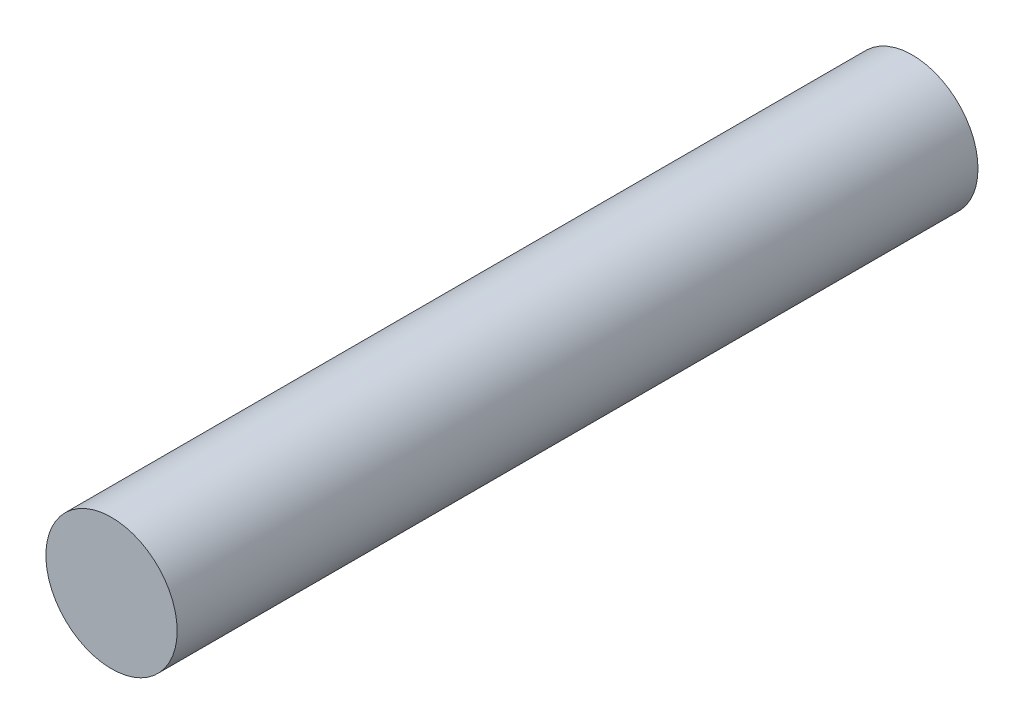
ISO-10303-21;
HEADER;
FILE_DESCRIPTION(('STEP AP214'),'2;1');
FILE_NAME('part.step','',(''),(''),'','','');
FILE_SCHEMA(('AUTOMOTIVE_DESIGN { 1 0 10303 214 1 1 1 1 }'));
ENDSEC;
DATA;
#1=APPLICATION_CONTEXT('core data for automotive mechanical design processes');
#2=APPLICATION_PROTOCOL_DEFINITION('international standard','automotive_design',2000,#1);
#3=PRODUCT_CONTEXT('',#1,'mechanical');
#4=PRODUCT('Part','Part','',(#3));
#5=PRODUCT_RELATED_PRODUCT_CATEGORY('part','',(#4));
#6=PRODUCT_DEFINITION_FORMATION('','',#4);
#7=PRODUCT_DEFINITION_CONTEXT('part definition',#1,'design');
#8=PRODUCT_DEFINITION('design','',#6,#7);
#9=PRODUCT_DEFINITION_SHAPE('','',#8);
#10=(LENGTH_UNIT() NAMED_UNIT(*) SI_UNIT(.MILLI.,.METRE.));
#11=(NAMED_UNIT(*) PLANE_ANGLE_UNIT() SI_UNIT($,.RADIAN.));
#12=(NAMED_UNIT(*) SI_UNIT($,.STERADIAN.) SOLID_ANGLE_UNIT());
#13=UNCERTAINTY_MEASURE_WITH_UNIT(LENGTH_MEASURE(1.E-05),#10,'distance_accuracy_value','');
#14=(GEOMETRIC_REPRESENTATION_CONTEXT(3) GLOBAL_UNCERTAINTY_ASSIGNED_CONTEXT((#13)) GLOBAL_UNIT_ASSIGNED_CONTEXT((#10,
#11,#12)) REPRESENTATION_CONTEXT('',''));
#15=CARTESIAN_POINT('',(0.,0.,0.));
#16=DIRECTION('',(0.,0.,1.));
#17=DIRECTION('',(1.,0.,0.));
#18=AXIS2_PLACEMENT_3D('',#15,#16,#17);
#19=CARTESIAN_POINT('',(-2155.,-5000.,14214.3145750508));
#20=DIRECTION('',(0.,0.,1.));
#21=DIRECTION('',(0.,-1.,0.));
#22=AXIS2_PLACEMENT_3D('',#19,#20,#21);
#23=CYLINDRICAL_SURFACE('',#22,200.);
#24=CARTESIAN_POINT('',(-2155.,-5000.,14780.));
#25=DIRECTION('',(0.,0.,1.));
#26=DIRECTION('',(1.,0.,0.));
#27=AXIS2_PLACEMENT_3D('',#24,#25,#26);
#28=CIRCLE('',#27,200.);
#29=CARTESIAN_POINT('',(-1955.,-5000.,14780.));
#30=VERTEX_POINT('',#29);
#31=EDGE_CURVE('E10',#30,#30,#28,.T.);
#32=ORIENTED_EDGE('',*,*,#31,.T.);
#33=EDGE_LOOP('',(#32));
#34=FACE_BOUND('',#33,.T.);
#35=CARTESIAN_POINT('',(-2155.,-5000.,17220.));
#36=DIRECTION('',(0.,0.,1.));
#37=DIRECTION('',(1.,0.,0.));
#38=AXIS2_PLACEMENT_3D('',#35,#36,#37);
#39=CIRCLE('',#38,200.);
#40=CARTESIAN_POINT('',(-1955.,-5000.,17220.));
#41=VERTEX_POINT('',#40);
#42=EDGE_CURVE('E39',#41,#41,#39,.F.);
#43=ORIENTED_EDGE('',*,*,#42,.T.);
#44=EDGE_LOOP('',(#43));
#45=FACE_BOUND('',#44,.T.);
#46=ADVANCED_FACE('F33',(#34,#45),#23,.T.);
#47=CARTESIAN_POINT('',(-2455.,0.,14780.));
#48=DIRECTION('',(0.,0.,1.));
#49=DIRECTION('',(1.,0.,0.));
#50=AXIS2_PLACEMENT_3D('',#47,#48,#49);
#51=PLANE('',#50);
#52=ORIENTED_EDGE('',*,*,#31,.F.);
#53=EDGE_LOOP('',(#52));
#54=FACE_BOUND('',#53,.T.);
#55=ADVANCED_FACE('F48',(#54),#51,.F.);
#56=CARTESIAN_POINT('',(-2455.,0.,17220.));
#57=DIRECTION('',(0.,0.,1.));
#58=DIRECTION('',(1.,0.,0.));
#59=AXIS2_PLACEMENT_3D('',#56,#57,#58);
#60=PLANE('',#59);
#61=ORIENTED_EDGE('',*,*,#42,.F.);
#62=EDGE_LOOP('',(#61));
#63=FACE_BOUND('',#62,.T.);
#64=ADVANCED_FACE('F46',(#63),#60,.T.);
#65=CLOSED_SHELL('',(#46,#55,#64));
#66=MANIFOLD_SOLID_BREP('B2',#65);
#67=ADVANCED_BREP_SHAPE_REPRESENTATION('',(#18,#66),#14);
#68=SHAPE_DEFINITION_REPRESENTATION(#9,#67);
ENDSEC;
END-ISO-10303-21;
